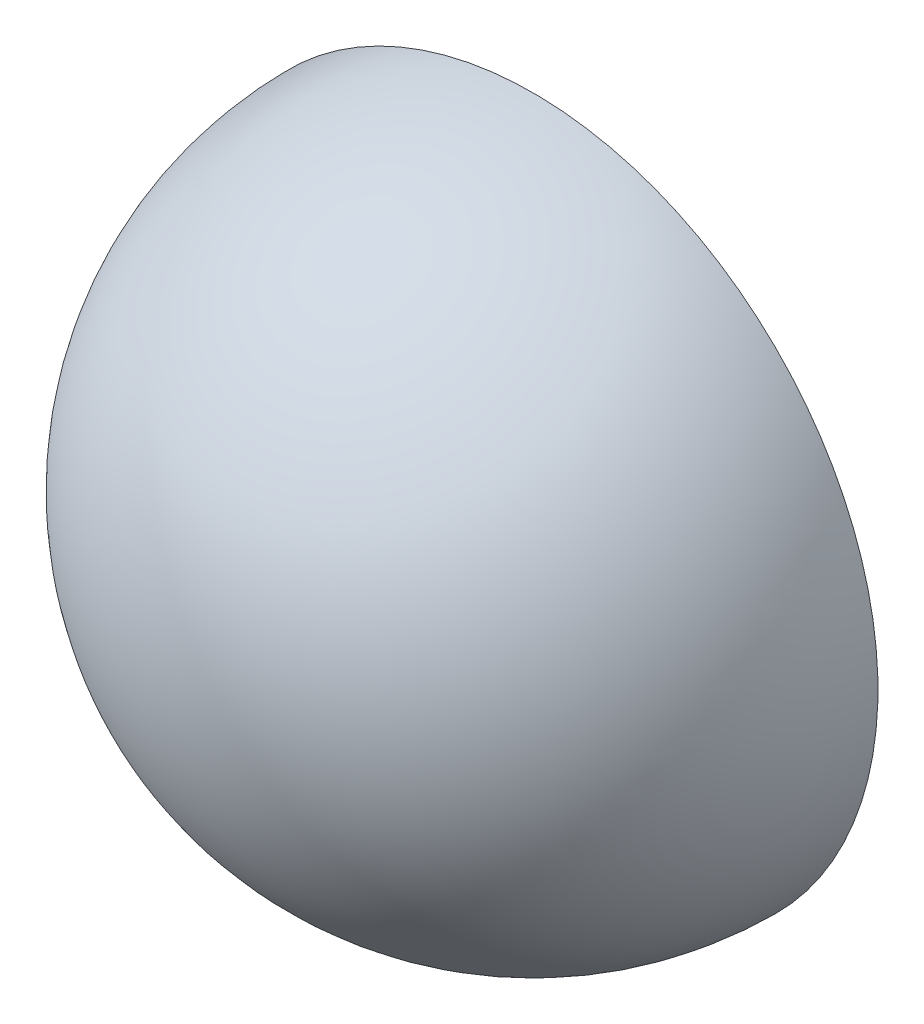
ISO-10303-21;
HEADER;
FILE_DESCRIPTION(('STEP AP214'),'2;1');
FILE_NAME('part.step','',(''),(''),'','','');
FILE_SCHEMA(('AUTOMOTIVE_DESIGN { 1 0 10303 214 1 1 1 1 }'));
ENDSEC;
DATA;
#1=APPLICATION_CONTEXT('core data for automotive mechanical design processes');
#2=APPLICATION_PROTOCOL_DEFINITION('international standard','automotive_design',2000,#1);
#3=PRODUCT_CONTEXT('',#1,'mechanical');
#4=PRODUCT('Part','Part','',(#3));
#5=PRODUCT_RELATED_PRODUCT_CATEGORY('part','',(#4));
#6=PRODUCT_DEFINITION_FORMATION('','',#4);
#7=PRODUCT_DEFINITION_CONTEXT('part definition',#1,'design');
#8=PRODUCT_DEFINITION('design','',#6,#7);
#9=PRODUCT_DEFINITION_SHAPE('','',#8);
#10=(LENGTH_UNIT() NAMED_UNIT(*) SI_UNIT(.MILLI.,.METRE.));
#11=(NAMED_UNIT(*) PLANE_ANGLE_UNIT() SI_UNIT($,.RADIAN.));
#12=(NAMED_UNIT(*) SI_UNIT($,.STERADIAN.) SOLID_ANGLE_UNIT());
#13=UNCERTAINTY_MEASURE_WITH_UNIT(LENGTH_MEASURE(1.E-05),#10,'distance_accuracy_value','');
#14=(GEOMETRIC_REPRESENTATION_CONTEXT(3) GLOBAL_UNCERTAINTY_ASSIGNED_CONTEXT((#13)) GLOBAL_UNIT_ASSIGNED_CONTEXT((#10,
#11,#12)) REPRESENTATION_CONTEXT('',''));
#15=CARTESIAN_POINT('',(0.,0.,0.));
#16=DIRECTION('',(0.,0.,1.));
#17=DIRECTION('',(1.,0.,0.));
#18=AXIS2_PLACEMENT_3D('',#15,#16,#17);
#19=CARTESIAN_POINT('',(0.,0.,0.));
#20=DIRECTION('',(0.,0.,-1.));
#21=DIRECTION('',(-1.,0.,0.));
#22=AXIS2_PLACEMENT_3D('',#19,#20,#21);
#23=PLANE('',#22);
#24=CARTESIAN_POINT('',(0.,0.,0.));
#25=DIRECTION('',(0.,0.,-1.));
#26=DIRECTION('',(-1.,0.,0.));
#27=AXIS2_PLACEMENT_3D('',#24,#25,#26);
#28=CIRCLE('',#27,25.);
#29=CARTESIAN_POINT('',(-25.,0.,-1.74574066942157E-13));
#30=VERTEX_POINT('',#29);
#31=EDGE_CURVE('E10',#30,#30,#28,.T.);
#32=ORIENTED_EDGE('',*,*,#31,.T.);
#33=EDGE_LOOP('',(#32));
#34=FACE_BOUND('',#33,.T.);
#35=CARTESIAN_POINT('',(0.,0.,0.));
#36=DIRECTION('',(0.,0.,-1.));
#37=DIRECTION('',(-1.,0.,0.));
#38=AXIS2_PLACEMENT_3D('',#35,#36,#37);
#39=CIRCLE('',#38,15.);
#40=CARTESIAN_POINT('',(-15.,0.,-1.04744440165294E-13));
#41=VERTEX_POINT('',#40);
#42=EDGE_CURVE('E35',#41,#41,#39,.F.);
#43=ORIENTED_EDGE('',*,*,#42,.T.);
#44=EDGE_LOOP('',(#43));
#45=FACE_BOUND('',#44,.T.);
#46=ADVANCED_FACE('F31',(#34,#45),#23,.T.);
#47=CARTESIAN_POINT('',(0.,0.,0.));
#48=DIRECTION('',(0.,1.,0.));
#49=DIRECTION('',(-1.,0.,0.));
#50=AXIS2_PLACEMENT_3D('',#47,#48,#49);
#51=SPHERICAL_SURFACE('',#50,25.);
#52=CARTESIAN_POINT('',(0.,0.,0.));
#53=DIRECTION('',(0.,0.,-1.));
#54=DIRECTION('',(-1.,0.,0.));
#55=AXIS2_PLACEMENT_3D('',#52,#53,#54);
#56=SPHERICAL_SURFACE('',#55,25.);
#57=ORIENTED_EDGE('',*,*,#31,.F.);
#58=EDGE_LOOP('',(#57));
#59=FACE_BOUND('',#58,.T.);
#60=ADVANCED_FACE('F33',(#59),#56,.T.);
#61=CARTESIAN_POINT('',(0.,0.,0.));
#62=DIRECTION('',(0.,1.,0.));
#63=DIRECTION('',(-1.,0.,0.));
#64=AXIS2_PLACEMENT_3D('',#61,#62,#63);
#65=SPHERICAL_SURFACE('',#64,15.);
#66=CARTESIAN_POINT('',(0.,0.,0.));
#67=DIRECTION('',(0.,0.,-1.));
#68=DIRECTION('',(-1.,0.,0.));
#69=AXIS2_PLACEMENT_3D('',#66,#67,#68);
#70=SPHERICAL_SURFACE('',#69,15.);
#71=ORIENTED_EDGE('',*,*,#42,.F.);
#72=EDGE_LOOP('',(#71));
#73=FACE_BOUND('',#72,.T.);
#74=ADVANCED_FACE('F45',(#73),#70,.F.);
#75=CLOSED_SHELL('',(#46,#60,#74));
#76=MANIFOLD_SOLID_BREP('B2',#75);
#77=ADVANCED_BREP_SHAPE_REPRESENTATION('',(#18,#76),#14);
#78=SHAPE_DEFINITION_REPRESENTATION(#9,#77);
ENDSEC;
END-ISO-10303-21;
